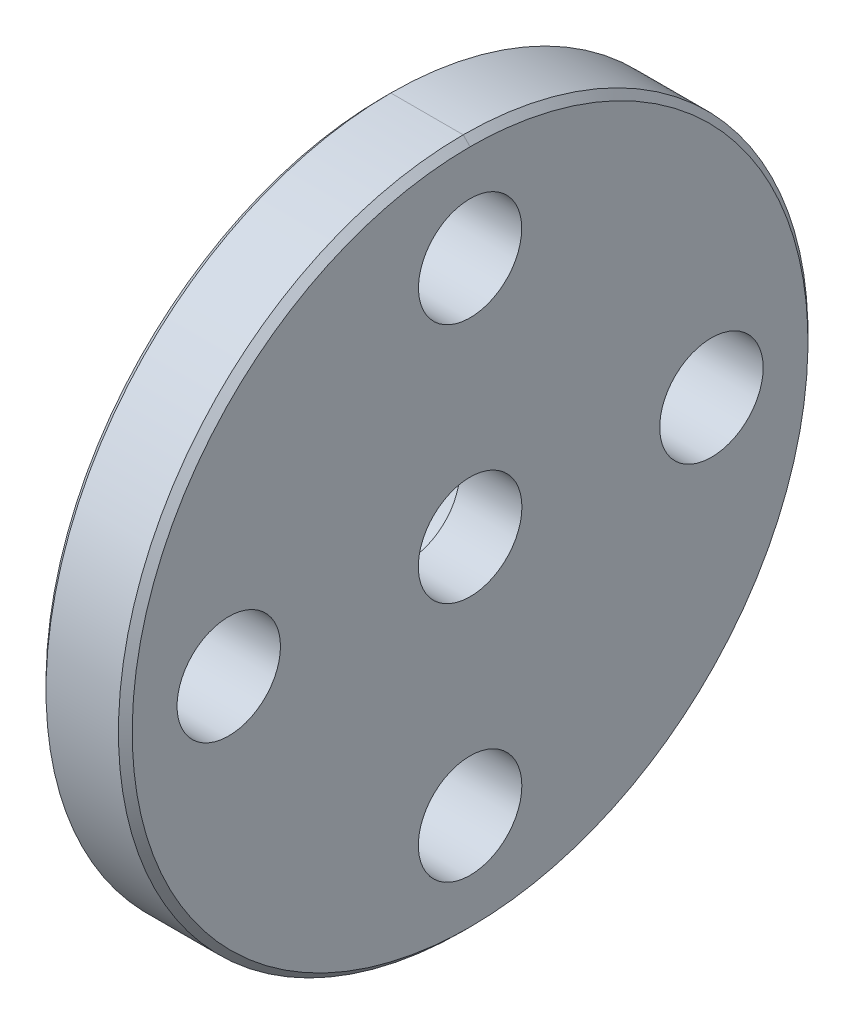
ISO-10303-21;
HEADER;
FILE_DESCRIPTION(('STEP AP214'),'2;1');
FILE_NAME('part.step','',(''),(''),'','','');
FILE_SCHEMA(('AUTOMOTIVE_DESIGN { 1 0 10303 214 1 1 1 1 }'));
ENDSEC;
DATA;
#1=APPLICATION_CONTEXT('core data for automotive mechanical design processes');
#2=APPLICATION_PROTOCOL_DEFINITION('international standard','automotive_design',2000,#1);
#3=PRODUCT_CONTEXT('',#1,'mechanical');
#4=PRODUCT('Part','Part','',(#3));
#5=PRODUCT_RELATED_PRODUCT_CATEGORY('part','',(#4));
#6=PRODUCT_DEFINITION_FORMATION('','',#4);
#7=PRODUCT_DEFINITION_CONTEXT('part definition',#1,'design');
#8=PRODUCT_DEFINITION('design','',#6,#7);
#9=PRODUCT_DEFINITION_SHAPE('','',#8);
#10=(LENGTH_UNIT() NAMED_UNIT(*) SI_UNIT(.MILLI.,.METRE.));
#11=(NAMED_UNIT(*) PLANE_ANGLE_UNIT() SI_UNIT($,.RADIAN.));
#12=(NAMED_UNIT(*) SI_UNIT($,.STERADIAN.) SOLID_ANGLE_UNIT());
#13=UNCERTAINTY_MEASURE_WITH_UNIT(LENGTH_MEASURE(1.E-05),#10,'distance_accuracy_value','');
#14=(GEOMETRIC_REPRESENTATION_CONTEXT(3) GLOBAL_UNCERTAINTY_ASSIGNED_CONTEXT((#13)) GLOBAL_UNIT_ASSIGNED_CONTEXT((#10,
#11,#12)) REPRESENTATION_CONTEXT('',''));
#15=CARTESIAN_POINT('',(0.,0.,0.));
#16=DIRECTION('',(0.,0.,1.));
#17=DIRECTION('',(1.,0.,0.));
#18=AXIS2_PLACEMENT_3D('',#15,#16,#17);
#19=CARTESIAN_POINT('',(29.998782131604,-72.9841148090467,91.5821207512656));
#20=DIRECTION('',(1.,0.,0.));
#21=DIRECTION('',(0.,1.,0.));
#22=AXIS2_PLACEMENT_3D('',#19,#20,#21);
#23=CYLINDRICAL_SURFACE('',#22,2.35);
#24=CARTESIAN_POINT('',(28.798782131604,-70.6341148090467,91.5821207512154));
#25=CARTESIAN_POINT('',(31.198782131604,-70.6341148090467,91.5821207512154));
#26=(BOUNDED_CURVE() B_SPLINE_CURVE(1,(#24,#25),.UNSPECIFIED.,.F.,
.F.) B_SPLINE_CURVE_WITH_KNOTS((2,2),(0.,2.4),
.UNSPECIFIED.) CURVE() GEOMETRIC_REPRESENTATION_ITEM() RATIONAL_B_SPLINE_CURVE((1.,1.)) REPRESENTATION_ITEM(''));
#27=CARTESIAN_POINT('',(28.798782131604,-70.6341148090467,91.5821207512154));
#28=VERTEX_POINT('',#27);
#29=CARTESIAN_POINT('',(31.198782131604,-70.6341148090467,91.5821207512154));
#30=VERTEX_POINT('',#29);
#31=EDGE_CURVE('E81',#28,#30,#26,.T.);
#32=ORIENTED_EDGE('',*,*,#31,.T.);
#33=CARTESIAN_POINT('',(31.198782131604,-70.6341148090467,91.5821207512154));
#34=CARTESIAN_POINT('',(31.198782131604,-70.6341148089966,93.9321207512156));
#35=CARTESIAN_POINT('',(31.198782131604,-72.9841148089966,93.9321207512656));
#36=CARTESIAN_POINT('',(31.198782131604,-75.3341148089965,93.9321207513156));
#37=CARTESIAN_POINT('',(31.198782131604,-75.3341148090467,91.5821207513157));
#38=(BOUNDED_CURVE() B_SPLINE_CURVE(2,(#33,#34,#35,#36,#37),.UNSPECIFIED.,.F.,
.F.) B_SPLINE_CURVE_WITH_KNOTS((3,2,3),(7.38274273593601,11.074114103904,14.765485471872),
.UNSPECIFIED.) CURVE() GEOMETRIC_REPRESENTATION_ITEM() RATIONAL_B_SPLINE_CURVE((1.,
0.707106781186548,1.,0.707106781186548,1.)) REPRESENTATION_ITEM(''));
#39=CARTESIAN_POINT('',(31.198782131604,-75.3341148090467,91.5821207513157));
#40=VERTEX_POINT('',#39);
#41=EDGE_CURVE('E214',#30,#40,#38,.T.);
#42=ORIENTED_EDGE('',*,*,#41,.T.);
#43=CARTESIAN_POINT('',(28.798782131604,-75.3341148090467,91.5821207513157));
#44=CARTESIAN_POINT('',(30.998782131604,-75.3341148090467,91.5821207513157));
#45=CARTESIAN_POINT('',(31.198782131604,-75.3341148090467,91.5821207513157));
#46=(BOUNDED_CURVE() B_SPLINE_CURVE(1,(#43,#44,#45),.UNSPECIFIED.,.F.,
.F.) B_SPLINE_CURVE_WITH_KNOTS((2,1,2),(0.299999999999963,2.5,2.69999999999995),
.UNSPECIFIED.) CURVE() GEOMETRIC_REPRESENTATION_ITEM() RATIONAL_B_SPLINE_CURVE((1.,1.,1.)) REPRESENTATION_ITEM(''));
#47=CARTESIAN_POINT('',(28.798782131604,-75.3341148090467,91.5821207513157));
#48=VERTEX_POINT('',#47);
#49=EDGE_CURVE('E71',#48,#40,#46,.T.);
#50=ORIENTED_EDGE('',*,*,#49,.F.);
#51=CARTESIAN_POINT('',(28.798782131604,-70.6341148090467,91.5821207512154));
#52=CARTESIAN_POINT('',(28.798782131604,-70.6341148089965,93.9321207512156));
#53=CARTESIAN_POINT('',(28.798782131604,-72.9841148089965,93.9321207512656));
#54=CARTESIAN_POINT('',(28.798782131604,-75.3341148089965,93.9321207513156));
#55=CARTESIAN_POINT('',(28.798782131604,-75.3341148090467,91.5821207513157));
#56=(BOUNDED_CURVE() B_SPLINE_CURVE(2,(#51,#52,#53,#54,#55),.UNSPECIFIED.,.F.,
.F.) B_SPLINE_CURVE_WITH_KNOTS((3,2,3),(7.38274273593601,11.074114103904,14.765485471872),
.UNSPECIFIED.) CURVE() GEOMETRIC_REPRESENTATION_ITEM() RATIONAL_B_SPLINE_CURVE((1.,
0.707106781186548,1.,0.707106781186548,1.)) REPRESENTATION_ITEM(''));
#57=EDGE_CURVE('E190',#28,#48,#56,.T.);
#58=ORIENTED_EDGE('',*,*,#57,.F.);
#59=EDGE_LOOP('',(#32,#42,#50,#58));
#60=FACE_BOUND('',#59,.T.);
#61=ADVANCED_FACE('F49',(#60),#23,.F.);
#62=CARTESIAN_POINT('',(28.9987821316039,-68.9841148090466,91.5821207511803));
#63=CARTESIAN_POINT('',(28.7987821316039,-69.1841148090466,91.5821207511846));
#64=CARTESIAN_POINT('',(28.9987821316039,-68.9841148091318,87.5821207511803));
#65=CARTESIAN_POINT('',(28.7987821316039,-69.1841148091275,87.7821207511846));
#66=CARTESIAN_POINT('',(28.9987821316039,-72.9841148091318,87.5821207512655));
#67=CARTESIAN_POINT('',(28.7987821316039,-72.9841148091276,87.7821207512655));
#68=CARTESIAN_POINT('',(28.9987821316039,-76.9841148091319,87.5821207513507));
#69=CARTESIAN_POINT('',(28.7987821316039,-76.7841148091276,87.7821207513465));
#70=CARTESIAN_POINT('',(28.9987821316039,-76.9841148090466,91.5821207513508));
#71=CARTESIAN_POINT('',(28.7987821316039,-76.7841148090467,91.5821207513465));
#72=(BOUNDED_SURFACE() B_SPLINE_SURFACE(2,1,((#62,#63),(#64,#65),(#66,#67),(#68,#69),(#70,#71)),
.UNSPECIFIED.,.F.,.F.,.F.) B_SPLINE_SURFACE_WITH_KNOTS((3,2,3),(2,2),(11.9377504733107,
17.906625709966,23.8755009466214),(0.,0.298660663245584),
.UNSPECIFIED.) GEOMETRIC_REPRESENTATION_ITEM() RATIONAL_B_SPLINE_SURFACE(((1.,1.),
(0.707106781186548,0.707106781186548),(1.,1.),(0.707106781186548,0.707106781186548),(1.,1.))) REPRESENTATION_ITEM('') SURFACE());
#73=CARTESIAN_POINT('',(28.9987821316039,-68.9841148090466,91.5821207511804));
#74=CARTESIAN_POINT('',(28.9987821316039,-68.9841148091319,87.5821207511803));
#75=CARTESIAN_POINT('',(28.9987821316039,-72.9841148091318,87.5821207512655));
#76=CARTESIAN_POINT('',(28.9987821316039,-76.9841148091319,87.5821207513507));
#77=CARTESIAN_POINT('',(28.9987821316039,-76.9841148090466,91.5821207513508));
#78=(BOUNDED_CURVE() B_SPLINE_CURVE(2,(#73,#74,#75,#76,#77),.UNSPECIFIED.,.F.,
.F.) B_SPLINE_CURVE_WITH_KNOTS((3,2,3),(11.9377504733106,17.906625709966,23.8755009466214),
.UNSPECIFIED.) CURVE() GEOMETRIC_REPRESENTATION_ITEM() RATIONAL_B_SPLINE_CURVE((1.,
0.707106781186545,1.,0.707106781186545,1.)) REPRESENTATION_ITEM(''));
#79=CARTESIAN_POINT('',(28.9987821316039,-68.9841148090466,91.5821207511804));
#80=VERTEX_POINT('',#79);
#81=CARTESIAN_POINT('',(28.9987821316039,-76.9841148090466,91.5821207513508));
#82=VERTEX_POINT('',#81);
#83=EDGE_CURVE('E277',#80,#82,#78,.T.);
#84=CARTESIAN_POINT('',(28.9987821316039,-76.9841148090466,91.5821207513508));
#85=CARTESIAN_POINT('',(28.7987821316039,-76.7841148090467,91.5821207513465));
#86=(BOUNDED_CURVE() B_SPLINE_CURVE(1,(#84,#85),.UNSPECIFIED.,.F.,
.F.) B_SPLINE_CURVE_WITH_KNOTS((2,2),(0.,0.298660663245584),
.UNSPECIFIED.) CURVE() GEOMETRIC_REPRESENTATION_ITEM() RATIONAL_B_SPLINE_CURVE((1.,1.)) REPRESENTATION_ITEM(''));
#87=CARTESIAN_POINT('',(28.7987821316039,-76.7841148090467,91.5821207513465));
#88=VERTEX_POINT('',#87);
#89=EDGE_CURVE('E424',#82,#88,#86,.T.);
#90=CARTESIAN_POINT('',(28.7987821316039,-69.1841148090466,91.5821207511846));
#91=CARTESIAN_POINT('',(28.7987821316039,-69.1841148091275,87.7821207511846));
#92=CARTESIAN_POINT('',(28.7987821316039,-72.9841148091276,87.7821207512655));
#93=CARTESIAN_POINT('',(28.7987821316039,-76.7841148091276,87.7821207513465));
#94=CARTESIAN_POINT('',(28.7987821316039,-76.7841148090467,91.5821207513465));
#95=(BOUNDED_CURVE() B_SPLINE_CURVE(2,(#90,#91,#92,#93,#94),.UNSPECIFIED.,.F.,
.F.) B_SPLINE_CURVE_WITH_KNOTS((3,2,3),(11.9377504733107,17.906625709966,23.8755009466214),
.UNSPECIFIED.) CURVE() GEOMETRIC_REPRESENTATION_ITEM() RATIONAL_B_SPLINE_CURVE((1.,
0.707106781186548,1.,0.707106781186548,1.)) REPRESENTATION_ITEM(''));
#96=CARTESIAN_POINT('',(28.7987821316039,-69.1841148090466,91.5821207511846));
#97=VERTEX_POINT('',#96);
#98=EDGE_CURVE('E239',#97,#88,#95,.T.);
#99=CARTESIAN_POINT('',(28.9987821316039,-68.9841148090466,91.5821207511803));
#100=CARTESIAN_POINT('',(28.7987821316039,-69.1841148090466,91.5821207511846));
#101=(BOUNDED_CURVE() B_SPLINE_CURVE(1,(#99,#100),.UNSPECIFIED.,.F.,
.F.) B_SPLINE_CURVE_WITH_KNOTS((2,2),(0.,0.298660663245584),
.UNSPECIFIED.) CURVE() GEOMETRIC_REPRESENTATION_ITEM() RATIONAL_B_SPLINE_CURVE((1.,1.)) REPRESENTATION_ITEM(''));
#102=EDGE_CURVE('E198',#80,#97,#101,.T.);
#103=ORIENTED_EDGE('',*,*,#83,.T.);
#104=ORIENTED_EDGE('',*,*,#89,.T.);
#105=ORIENTED_EDGE('',*,*,#98,.F.);
#106=ORIENTED_EDGE('',*,*,#102,.F.);
#107=EDGE_LOOP('',(#103,#104,#105,#106));
#108=FACE_BOUND('',#107,.T.);
#109=ADVANCED_FACE('F475',(#108),#72,.T.);
#110=CARTESIAN_POINT('',(29.498782131604,-72.9841148090466,91.5821207512656));
#111=DIRECTION('',(1.,0.,0.));
#112=DIRECTION('',(0.,1.,0.));
#113=AXIS2_PLACEMENT_3D('',#110,#111,#112);
#114=CYLINDRICAL_SURFACE('',#113,4.);
#115=CARTESIAN_POINT('',(30.2987821316041,-68.9841148090466,91.5821207511804));
#116=CARTESIAN_POINT('',(28.998782131604,-68.9841148090466,91.5821207511804));
#117=(BOUNDED_CURVE() B_SPLINE_CURVE(1,(#115,#116),.UNSPECIFIED.,.F.,
.F.) B_SPLINE_CURVE_WITH_KNOTS((2,2),(0.199999999999992,1.50000000000006),
.UNSPECIFIED.) CURVE() GEOMETRIC_REPRESENTATION_ITEM() RATIONAL_B_SPLINE_CURVE((1.,1.)) REPRESENTATION_ITEM(''));
#118=CARTESIAN_POINT('',(30.298782131604,-68.9841148090466,91.5821207511803));
#119=VERTEX_POINT('',#118);
#120=EDGE_CURVE('E286',#119,#80,#117,.T.);
#121=ORIENTED_EDGE('',*,*,#120,.T.);
#122=CARTESIAN_POINT('',(28.9987821316039,-76.9841148090466,91.5821207513508));
#123=CARTESIAN_POINT('',(28.9987821316039,-76.9841148089614,95.5821207513508));
#124=CARTESIAN_POINT('',(28.9987821316039,-72.9841148089614,95.5821207512656));
#125=CARTESIAN_POINT('',(28.9987821316039,-68.9841148089614,95.5821207511804));
#126=CARTESIAN_POINT('',(28.9987821316039,-68.9841148090466,91.5821207511804));
#127=(BOUNDED_CURVE() B_SPLINE_CURVE(2,(#122,#123,#124,#125,#126),.UNSPECIFIED.,.F.,
.F.) B_SPLINE_CURVE_WITH_KNOTS((3,2,3),(0.,5.96887523665532,11.9377504733106),
.UNSPECIFIED.) CURVE() GEOMETRIC_REPRESENTATION_ITEM() RATIONAL_B_SPLINE_CURVE((1.,
0.70710678118655,1.,0.70710678118655,1.)) REPRESENTATION_ITEM(''));
#128=EDGE_CURVE('E408',#82,#80,#127,.T.);
#129=ORIENTED_EDGE('',*,*,#128,.F.);
#130=CARTESIAN_POINT('',(30.298782131604,-76.9841148090466,91.5821207513508));
#131=CARTESIAN_POINT('',(28.9987821316039,-76.9841148090466,91.5821207513508));
#132=(BOUNDED_CURVE() B_SPLINE_CURVE(1,(#130,#131),.UNSPECIFIED.,.F.,
.F.) B_SPLINE_CURVE_WITH_KNOTS((2,2),(0.199999999999992,1.50000000000003),
.UNSPECIFIED.) CURVE() GEOMETRIC_REPRESENTATION_ITEM() RATIONAL_B_SPLINE_CURVE((1.,1.)) REPRESENTATION_ITEM(''));
#133=CARTESIAN_POINT('',(30.298782131604,-76.9841148090466,91.5821207513508));
#134=VERTEX_POINT('',#133);
#135=EDGE_CURVE('E287',#134,#82,#132,.T.);
#136=ORIENTED_EDGE('',*,*,#135,.F.);
#137=CARTESIAN_POINT('',(30.298782131604,-68.9841148090466,91.5821207511803));
#138=CARTESIAN_POINT('',(30.298782131604,-68.9841148089612,95.5821207511803));
#139=CARTESIAN_POINT('',(30.298782131604,-72.9841148089613,95.5821207512655));
#140=CARTESIAN_POINT('',(30.298782131604,-76.9841148089613,95.5821207513508));
#141=CARTESIAN_POINT('',(30.298782131604,-76.9841148090466,91.5821207513508));
#142=(BOUNDED_CURVE() B_SPLINE_CURVE(2,(#137,#138,#139,#140,#141),.UNSPECIFIED.,.F.,
.F.) B_SPLINE_CURVE_WITH_KNOTS((3,2,3),(13.1946839362894,19.7920259044341,26.3893678725789),
.UNSPECIFIED.) CURVE() GEOMETRIC_REPRESENTATION_ITEM() RATIONAL_B_SPLINE_CURVE((1.,
0.707106781186547,1.,0.707106781186547,1.)) REPRESENTATION_ITEM(''));
#143=EDGE_CURVE('E11',#119,#134,#142,.T.);
#144=ORIENTED_EDGE('',*,*,#143,.F.);
#145=EDGE_LOOP('',(#121,#129,#136,#144));
#146=FACE_BOUND('',#145,.T.);
#147=ADVANCED_FACE('F485',(#146),#114,.T.);
#148=CARTESIAN_POINT('',(30.298782131604,-68.9841148090465,91.5821207511803));
#149=CARTESIAN_POINT('',(30.498782131604,-68.784114809043,91.5821207511761));
#150=CARTESIAN_POINT('',(30.298782131604,-68.9841148089612,95.5821207511803));
#151=CARTESIAN_POINT('',(30.498782131604,-68.7841148089535,95.7821207511796));
#152=CARTESIAN_POINT('',(30.298782131604,-72.9841148089613,95.5821207512656));
#153=CARTESIAN_POINT('',(30.498782131604,-72.9841148089571,95.7821207512691));
#154=CARTESIAN_POINT('',(30.298782131604,-76.9841148089615,95.5821207513509));
#155=CARTESIAN_POINT('',(30.498782131604,-77.1841148089606,95.7821207513587));
#156=CARTESIAN_POINT('',(30.298782131604,-76.9841148090466,91.5821207513508));
#157=CARTESIAN_POINT('',(30.498782131604,-77.1841148090501,91.582120751355));
#158=(BOUNDED_SURFACE() B_SPLINE_SURFACE(2,1,((#148,#149),(#150,#151),(#152,#153),(#154,#155),
(#156,#157)),.UNSPECIFIED.,.F.,.F.,.F.) B_SPLINE_SURFACE_WITH_KNOTS((3,2,3),(2,2),
(13.1946839362894,19.7920259044341,26.3893678725789),(0.,0.283684158372664),
.UNSPECIFIED.) GEOMETRIC_REPRESENTATION_ITEM() RATIONAL_B_SPLINE_SURFACE(((1.,1.),
(0.707106781186548,0.707106781186548),(1.,1.),(0.707106781186548,0.707106781186548),(1.,1.))) REPRESENTATION_ITEM('') SURFACE());
#159=CARTESIAN_POINT('',(30.298782131604,-76.9841148090466,91.5821207513508));
#160=CARTESIAN_POINT('',(30.498782131604,-77.1841148090501,91.582120751355));
#161=(BOUNDED_CURVE() B_SPLINE_CURVE(1,(#159,#160),.UNSPECIFIED.,.F.,
.F.) B_SPLINE_CURVE_WITH_KNOTS((2,2),(0.,0.283684158372664),
.UNSPECIFIED.) CURVE() GEOMETRIC_REPRESENTATION_ITEM() RATIONAL_B_SPLINE_CURVE((1.,1.)) REPRESENTATION_ITEM(''));
#162=CARTESIAN_POINT('',(30.498782131604,-77.1841148090501,91.582120751355));
#163=VERTEX_POINT('',#162);
#164=EDGE_CURVE('E329',#134,#163,#161,.T.);
#165=CARTESIAN_POINT('',(30.498782131604,-68.784114809043,91.5821207511761));
#166=CARTESIAN_POINT('',(30.498782131604,-68.7841148089535,95.7821207511796));
#167=CARTESIAN_POINT('',(30.498782131604,-72.9841148089571,95.7821207512691));
#168=CARTESIAN_POINT('',(30.498782131604,-77.1841148089606,95.7821207513585));
#169=CARTESIAN_POINT('',(30.498782131604,-77.1841148090501,91.582120751355));
#170=(BOUNDED_CURVE() B_SPLINE_CURVE(2,(#165,#166,#167,#168,#169),.UNSPECIFIED.,.F.,
.F.) B_SPLINE_CURVE_WITH_KNOTS((3,2,3),(13.1946839362894,19.7920259044342,26.3893678725789),
.UNSPECIFIED.) CURVE() GEOMETRIC_REPRESENTATION_ITEM() RATIONAL_B_SPLINE_CURVE((1.,
0.707106781186548,1.,0.707106781186548,1.)) REPRESENTATION_ITEM(''));
#171=CARTESIAN_POINT('',(30.498782131604,-68.784114809043,91.5821207511761));
#172=VERTEX_POINT('',#171);
#173=EDGE_CURVE('E168',#172,#163,#170,.T.);
#174=CARTESIAN_POINT('',(30.298782131604,-68.9841148090465,91.5821207511803));
#175=CARTESIAN_POINT('',(30.498782131604,-68.784114809043,91.5821207511761));
#176=(BOUNDED_CURVE() B_SPLINE_CURVE(1,(#174,#175),.UNSPECIFIED.,.F.,
.F.) B_SPLINE_CURVE_WITH_KNOTS((2,2),(0.,0.283684158372664),
.UNSPECIFIED.) CURVE() GEOMETRIC_REPRESENTATION_ITEM() RATIONAL_B_SPLINE_CURVE((1.,1.)) REPRESENTATION_ITEM(''));
#177=EDGE_CURVE('E321',#119,#172,#176,.T.);
#178=ORIENTED_EDGE('',*,*,#143,.T.);
#179=ORIENTED_EDGE('',*,*,#164,.T.);
#180=ORIENTED_EDGE('',*,*,#173,.F.);
#181=ORIENTED_EDGE('',*,*,#177,.F.);
#182=EDGE_LOOP('',(#178,#179,#180,#181));
#183=FACE_BOUND('',#182,.T.);
#184=ADVANCED_FACE('F497',(#183),#158,.T.);
#185=CARTESIAN_POINT('',(32.7987821316026,-62.9841148090466,91.5821207510525));
#186=CARTESIAN_POINT('',(32.9987821316027,-63.1841148089811,91.5821207510568));
#187=CARTESIAN_POINT('',(32.7987821316029,-62.9841148088335,101.582120751053));
#188=CARTESIAN_POINT('',(32.9987821316029,-63.1841148087723,101.382120751122));
#189=CARTESIAN_POINT('',(32.7987821316036,-72.9841148088335,101.582120751266));
#190=CARTESIAN_POINT('',(32.9987821316036,-72.9841148088377,101.382120751331));
#191=CARTESIAN_POINT('',(32.7987821316043,-82.9841148088335,101.582120751479));
#192=CARTESIAN_POINT('',(32.9987821316043,-82.7841148089032,101.38212075154));
#193=CARTESIAN_POINT('',(32.7987821316041,-82.9841148090465,91.5821207514786));
#194=CARTESIAN_POINT('',(32.9987821316041,-82.784114809112,91.5821207514744));
#195=(BOUNDED_SURFACE() B_SPLINE_SURFACE(2,1,((#185,#186),(#187,#188),(#189,#190),(#191,#192),
(#193,#194)),.UNSPECIFIED.,.F.,.F.,.F.) B_SPLINE_SURFACE_WITH_KNOTS((3,2,3),(2,2),
(30.7876044049581,46.1814066074371,61.5752088099162),(0.,0.283092981276021),
.UNSPECIFIED.) GEOMETRIC_REPRESENTATION_ITEM() RATIONAL_B_SPLINE_SURFACE(((1.,1.),
(0.707106781186548,0.707106781186548),(1.,1.),(0.707106781186548,0.707106781186548),(1.,1.))) REPRESENTATION_ITEM('') SURFACE());
#196=CARTESIAN_POINT('',(32.798782131604,-62.9841148090465,91.5821207510525));
#197=CARTESIAN_POINT('',(32.798782131604,-62.9841148088334,101.582120751053));
#198=CARTESIAN_POINT('',(32.798782131604,-72.9841148088335,101.582120751266));
#199=CARTESIAN_POINT('',(32.798782131604,-82.9841148088335,101.582120751479));
#200=CARTESIAN_POINT('',(32.7987821316041,-82.9841148090466,91.5821207514786));
#201=(BOUNDED_CURVE() B_SPLINE_CURVE(2,(#196,#197,#198,#199,#200),.UNSPECIFIED.,.F.,
.F.) B_SPLINE_CURVE_WITH_KNOTS((3,2,3),(30.7876044049581,46.1814066074371,61.5752088099162),
.UNSPECIFIED.) CURVE() GEOMETRIC_REPRESENTATION_ITEM() RATIONAL_B_SPLINE_CURVE((1.,
0.707106781186547,1.,0.707106781186547,1.)) REPRESENTATION_ITEM(''));
#202=CARTESIAN_POINT('',(32.798782131604,-62.9841148090465,91.5821207510525));
#203=VERTEX_POINT('',#202);
#204=CARTESIAN_POINT('',(32.7987821316041,-82.9841148090465,91.5821207514787));
#205=VERTEX_POINT('',#204);
#206=EDGE_CURVE('E59',#203,#205,#201,.T.);
#207=CARTESIAN_POINT('',(32.7987821316041,-82.9841148090465,91.5821207514787));
#208=CARTESIAN_POINT('',(32.9987821316041,-82.784114809112,91.5821207514744));
#209=(BOUNDED_CURVE() B_SPLINE_CURVE(1,(#207,#208),.UNSPECIFIED.,.F.,
.F.) B_SPLINE_CURVE_WITH_KNOTS((2,2),(0.,0.283092981276021),
.UNSPECIFIED.) CURVE() GEOMETRIC_REPRESENTATION_ITEM() RATIONAL_B_SPLINE_CURVE((1.,1.)) REPRESENTATION_ITEM(''));
#210=CARTESIAN_POINT('',(32.9987821316041,-82.784114809112,91.5821207514744));
#211=VERTEX_POINT('',#210);
#212=EDGE_CURVE('E313',#205,#211,#209,.T.);
#213=CARTESIAN_POINT('',(32.998782131604,-63.1841148089812,91.5821207510568));
#214=CARTESIAN_POINT('',(32.998782131604,-63.1841148087724,101.382120751122));
#215=CARTESIAN_POINT('',(32.998782131604,-72.9841148088377,101.382120751331));
#216=CARTESIAN_POINT('',(32.998782131604,-82.784114808903,101.38212075154));
#217=CARTESIAN_POINT('',(32.998782131604,-82.7841148091119,91.5821207514744));
#218=(BOUNDED_CURVE() B_SPLINE_CURVE(2,(#213,#214,#215,#216,#217),.UNSPECIFIED.,.F.,
.F.) B_SPLINE_CURVE_WITH_KNOTS((3,2,3),(30.7876044049581,46.1814066074371,61.5752088099162),
.UNSPECIFIED.) CURVE() GEOMETRIC_REPRESENTATION_ITEM() RATIONAL_B_SPLINE_CURVE((1.,
0.707106781186547,1.,0.707106781186547,1.)) REPRESENTATION_ITEM(''));
#219=CARTESIAN_POINT('',(32.998782131604,-63.1841148089812,91.5821207510568));
#220=VERTEX_POINT('',#219);
#221=EDGE_CURVE('E276',#220,#211,#218,.T.);
#222=CARTESIAN_POINT('',(32.7987821316026,-62.9841148090466,91.5821207510525));
#223=CARTESIAN_POINT('',(32.9987821316027,-63.1841148089811,91.5821207510568));
#224=(BOUNDED_CURVE() B_SPLINE_CURVE(1,(#222,#223),.UNSPECIFIED.,.F.,
.F.) B_SPLINE_CURVE_WITH_KNOTS((2,2),(0.,0.283092981276021),
.UNSPECIFIED.) CURVE() GEOMETRIC_REPRESENTATION_ITEM() RATIONAL_B_SPLINE_CURVE((1.,1.)) REPRESENTATION_ITEM(''));
#225=EDGE_CURVE('E296',#203,#220,#224,.T.);
#226=ORIENTED_EDGE('',*,*,#206,.T.);
#227=ORIENTED_EDGE('',*,*,#212,.T.);
#228=ORIENTED_EDGE('',*,*,#221,.F.);
#229=ORIENTED_EDGE('',*,*,#225,.F.);
#230=EDGE_LOOP('',(#226,#227,#228,#229));
#231=FACE_BOUND('',#230,.T.);
#232=ADVANCED_FACE('F537',(#231),#195,.T.);
#233=CARTESIAN_POINT('',(30.698782131604,-62.9841148090466,91.5821207510525));
#234=CARTESIAN_POINT('',(30.698782131604,-62.9841148088335,101.582120751053));
#235=CARTESIAN_POINT('',(30.698782131604,-72.9841148088335,101.582120751266));
#236=CARTESIAN_POINT('',(30.698782131604,-82.9841148088335,101.582120751479));
#237=CARTESIAN_POINT('',(30.698782131604,-82.9841148090466,91.5821207514786));
#238=CARTESIAN_POINT('',(30.4987821316041,-63.1841148089811,91.5821207510567));
#239=CARTESIAN_POINT('',(30.4987821316041,-63.1841148087723,101.382120751122));
#240=CARTESIAN_POINT('',(30.4987821316041,-72.9841148088377,101.382120751331));
#241=CARTESIAN_POINT('',(30.4987821316041,-82.7841148089031,101.38212075154));
#242=CARTESIAN_POINT('',(30.4987821316041,-82.784114809112,91.5821207514744));
#243=(BOUNDED_SURFACE() B_SPLINE_SURFACE(1,2,((#233,#234,#235,#236,#237),(#238,#239,#240,#241,
#242)),.UNSPECIFIED.,.F.,.F.,.F.) B_SPLINE_SURFACE_WITH_KNOTS((2,2),(3,2,3),(0.,
0.283092981276209),(30.787604404958,46.181406607437,61.575208809916),
.UNSPECIFIED.) GEOMETRIC_REPRESENTATION_ITEM() RATIONAL_B_SPLINE_SURFACE(((1.,0.707106781186548,
1.,0.707106781186548,1.),(1.,0.707106781186548,1.,0.707106781186548,1.))) REPRESENTATION_ITEM('') SURFACE());
#244=CARTESIAN_POINT('',(30.698782131604,-62.9841148090466,91.5821207510525));
#245=CARTESIAN_POINT('',(30.4987821316041,-63.1841148089811,91.5821207510567));
#246=(BOUNDED_CURVE() B_SPLINE_CURVE(1,(#244,#245),.UNSPECIFIED.,.F.,
.F.) B_SPLINE_CURVE_WITH_KNOTS((2,2),(0.,0.283092981276209),
.UNSPECIFIED.) CURVE() GEOMETRIC_REPRESENTATION_ITEM() RATIONAL_B_SPLINE_CURVE((1.,1.)) REPRESENTATION_ITEM(''));
#247=CARTESIAN_POINT('',(30.698782131604,-62.9841148090466,91.5821207510525));
#248=VERTEX_POINT('',#247);
#249=CARTESIAN_POINT('',(30.498782131604,-63.1841148089812,91.5821207510567));
#250=VERTEX_POINT('',#249);
#251=EDGE_CURVE('E167',#248,#250,#246,.T.);
#252=CARTESIAN_POINT('',(30.498782131604,-63.1841148089812,91.5821207510567));
#253=CARTESIAN_POINT('',(30.498782131604,-63.1841148087724,101.382120751122));
#254=CARTESIAN_POINT('',(30.498782131604,-72.9841148088377,101.382120751331));
#255=CARTESIAN_POINT('',(30.498782131604,-82.784114808903,101.38212075154));
#256=CARTESIAN_POINT('',(30.498782131604,-82.7841148091119,91.5821207514743));
#257=(BOUNDED_CURVE() B_SPLINE_CURVE(2,(#252,#253,#254,#255,#256),.UNSPECIFIED.,.F.,
.F.) B_SPLINE_CURVE_WITH_KNOTS((3,2,3),(30.7876044049579,46.181406607437,61.575208809916),
.UNSPECIFIED.) CURVE() GEOMETRIC_REPRESENTATION_ITEM() RATIONAL_B_SPLINE_CURVE((1.,
0.707106781186547,1.,0.707106781186547,1.)) REPRESENTATION_ITEM(''));
#258=CARTESIAN_POINT('',(30.4987821316041,-82.784114809112,91.5821207514744));
#259=VERTEX_POINT('',#258);
#260=EDGE_CURVE('E172',#250,#259,#257,.T.);
#261=CARTESIAN_POINT('',(30.698782131604,-82.9841148090466,91.5821207514786));
#262=CARTESIAN_POINT('',(30.4987821316041,-82.784114809112,91.5821207514744));
#263=(BOUNDED_CURVE() B_SPLINE_CURVE(1,(#261,#262),.UNSPECIFIED.,.F.,
.F.) B_SPLINE_CURVE_WITH_KNOTS((2,2),(0.,0.283092981276209),
.UNSPECIFIED.) CURVE() GEOMETRIC_REPRESENTATION_ITEM() RATIONAL_B_SPLINE_CURVE((1.,1.)) REPRESENTATION_ITEM(''));
#264=CARTESIAN_POINT('',(30.698782131604,-82.9841148090466,91.5821207514786));
#265=VERTEX_POINT('',#264);
#266=EDGE_CURVE('E155',#265,#259,#263,.T.);
#267=CARTESIAN_POINT('',(30.698782131604,-62.9841148090466,91.5821207510525));
#268=CARTESIAN_POINT('',(30.6987821316039,-62.9841148088335,101.582120751052));
#269=CARTESIAN_POINT('',(30.698782131604,-72.9841148088335,101.582120751266));
#270=CARTESIAN_POINT('',(30.698782131604,-82.9841148088335,101.582120751479));
#271=CARTESIAN_POINT('',(30.698782131604,-82.9841148090466,91.5821207514786));
#272=(BOUNDED_CURVE() B_SPLINE_CURVE(2,(#267,#268,#269,#270,#271),.UNSPECIFIED.,.F.,
.F.) B_SPLINE_CURVE_WITH_KNOTS((3,2,3),(30.787604404958,46.181406607437,61.575208809916),
.UNSPECIFIED.) CURVE() GEOMETRIC_REPRESENTATION_ITEM() RATIONAL_B_SPLINE_CURVE((1.,
0.707106781186547,1.,0.707106781186547,1.)) REPRESENTATION_ITEM(''));
#273=EDGE_CURVE('E215',#248,#265,#272,.T.);
#274=ORIENTED_EDGE('',*,*,#251,.T.);
#275=ORIENTED_EDGE('',*,*,#260,.T.);
#276=ORIENTED_EDGE('',*,*,#266,.F.);
#277=ORIENTED_EDGE('',*,*,#273,.F.);
#278=EDGE_LOOP('',(#274,#275,#276,#277));
#279=FACE_BOUND('',#278,.T.);
#280=ADVANCED_FACE('F176',(#279),#243,.T.);
#281=CARTESIAN_POINT('',(31.748782131604,-72.9841148090465,91.5821207512656));
#282=DIRECTION('',(1.,0.,0.));
#283=DIRECTION('',(0.,1.,0.));
#284=AXIS2_PLACEMENT_3D('',#281,#282,#283);
#285=CYLINDRICAL_SURFACE('',#284,10.);
#286=CARTESIAN_POINT('',(32.798782131604,-62.9841148090465,91.5821207510525));
#287=CARTESIAN_POINT('',(30.698782131604,-62.9841148090466,91.5821207510525));
#288=(BOUNDED_CURVE() B_SPLINE_CURVE(1,(#286,#287),.UNSPECIFIED.,.F.,
.F.) B_SPLINE_CURVE_WITH_KNOTS((2,2),(0.199999999999988,2.3),
.UNSPECIFIED.) CURVE() GEOMETRIC_REPRESENTATION_ITEM() RATIONAL_B_SPLINE_CURVE((1.,1.)) REPRESENTATION_ITEM(''));
#289=EDGE_CURVE('E178',#203,#248,#288,.T.);
#290=ORIENTED_EDGE('',*,*,#289,.T.);
#291=ORIENTED_EDGE('',*,*,#273,.T.);
#292=CARTESIAN_POINT('',(32.7987821316041,-82.9841148090465,91.5821207514787));
#293=CARTESIAN_POINT('',(30.698782131604,-82.9841148090466,91.5821207514786));
#294=(BOUNDED_CURVE() B_SPLINE_CURVE(1,(#292,#293),.UNSPECIFIED.,.F.,
.F.) B_SPLINE_CURVE_WITH_KNOTS((2,2),(0.199999999999988,2.3),
.UNSPECIFIED.) CURVE() GEOMETRIC_REPRESENTATION_ITEM() RATIONAL_B_SPLINE_CURVE((1.,1.)) REPRESENTATION_ITEM(''));
#295=EDGE_CURVE('E448',#205,#265,#294,.T.);
#296=ORIENTED_EDGE('',*,*,#295,.F.);
#297=ORIENTED_EDGE('',*,*,#206,.F.);
#298=EDGE_LOOP('',(#290,#291,#296,#297));
#299=FACE_BOUND('',#298,.T.);
#300=ADVANCED_FACE('F557',(#299),#285,.T.);
#301=CARTESIAN_POINT('',(29.998782131604,-72.9841148090467,91.5821207512655));
#302=DIRECTION('',(1.,0.,0.));
#303=DIRECTION('',(0.,1.,0.));
#304=AXIS2_PLACEMENT_3D('',#301,#302,#303);
#305=CYLINDRICAL_SURFACE('',#304,2.35);
#306=CARTESIAN_POINT('',(28.798782131604,-75.3341148090467,91.5821207513157));
#307=CARTESIAN_POINT('',(28.798782131604,-75.3341148090967,89.2321207513157));
#308=CARTESIAN_POINT('',(28.798782131604,-72.9841148090967,89.2321207512655));
#309=CARTESIAN_POINT('',(28.798782131604,-70.6341148090966,89.2321207512155));
#310=CARTESIAN_POINT('',(28.798782131604,-70.6341148090467,91.5821207512154));
#311=(BOUNDED_CURVE() B_SPLINE_CURVE(2,(#306,#307,#308,#309,#310),.UNSPECIFIED.,.F.,
.F.) B_SPLINE_CURVE_WITH_KNOTS((3,2,3),(0.,3.69137136796801,7.38274273593601),
.UNSPECIFIED.) CURVE() GEOMETRIC_REPRESENTATION_ITEM() RATIONAL_B_SPLINE_CURVE((1.,
0.707106781186548,1.,0.707106781186548,1.)) REPRESENTATION_ITEM(''));
#312=EDGE_CURVE('E199',#48,#28,#311,.T.);
#313=ORIENTED_EDGE('',*,*,#312,.F.);
#314=ORIENTED_EDGE('',*,*,#49,.T.);
#315=CARTESIAN_POINT('',(31.198782131604,-75.3341148090467,91.5821207513157));
#316=CARTESIAN_POINT('',(31.198782131604,-75.3341148090967,89.2321207513157));
#317=CARTESIAN_POINT('',(31.198782131604,-72.9841148090967,89.2321207512655));
#318=CARTESIAN_POINT('',(31.198782131604,-70.6341148090968,89.2321207512155));
#319=CARTESIAN_POINT('',(31.198782131604,-70.6341148090467,91.5821207512154));
#320=(BOUNDED_CURVE() B_SPLINE_CURVE(2,(#315,#316,#317,#318,#319),.UNSPECIFIED.,.F.,
.F.) B_SPLINE_CURVE_WITH_KNOTS((3,2,3),(0.,3.69137136796801,7.38274273593601),
.UNSPECIFIED.) CURVE() GEOMETRIC_REPRESENTATION_ITEM() RATIONAL_B_SPLINE_CURVE((1.,
0.707106781186548,1.,0.707106781186548,1.)) REPRESENTATION_ITEM(''));
#321=EDGE_CURVE('E206',#40,#30,#320,.T.);
#322=ORIENTED_EDGE('',*,*,#321,.T.);
#323=ORIENTED_EDGE('',*,*,#31,.F.);
#324=EDGE_LOOP('',(#313,#314,#322,#323));
#325=FACE_BOUND('',#324,.T.);
#326=ADVANCED_FACE('F51',(#325),#305,.F.);
#327=CARTESIAN_POINT('',(31.1987821316039,-75.9216148091092,88.644620751328));
#328=DIRECTION('',(-1.,0.,0.));
#329=DIRECTION('',(0.,0.,1.));
#330=AXIS2_PLACEMENT_3D('',#327,#328,#329);
#331=PLANE('',#330);
#332=CARTESIAN_POINT('',(31.1987821316039,-72.9841148090466,91.5821207512655));
#333=DIRECTION('',(-1.,0.,0.));
#334=DIRECTION('',(0.,0.,1.));
#335=AXIS2_PLACEMENT_3D('',#332,#333,#334);
#336=CIRCLE('',#335,1.50304545185923);
#337=CARTESIAN_POINT('',(31.1987821316039,-72.9841148090466,93.0851662031248));
#338=VERTEX_POINT('',#337);
#339=EDGE_CURVE('E639',#338,#338,#336,.T.);
#340=ORIENTED_EDGE('',*,*,#339,.F.);
#341=EDGE_LOOP('',(#340));
#342=FACE_BOUND('',#341,.T.);
#343=ORIENTED_EDGE('',*,*,#41,.F.);
#344=ORIENTED_EDGE('',*,*,#321,.F.);
#345=EDGE_LOOP('',(#343,#344));
#346=FACE_BOUND('',#345,.T.);
#347=ADVANCED_FACE('F558',(#342,#346),#331,.T.);
#348=CARTESIAN_POINT('',(28.9987821316039,-76.9841148090466,91.5821207513508));
#349=CARTESIAN_POINT('',(28.7987821316039,-76.7841148090467,91.5821207513465));
#350=CARTESIAN_POINT('',(28.9987821316039,-76.9841148089615,95.5821207513508));
#351=CARTESIAN_POINT('',(28.7987821316039,-76.7841148089657,95.3821207513467));
#352=CARTESIAN_POINT('',(28.9987821316039,-72.9841148089614,95.5821207512656));
#353=CARTESIAN_POINT('',(28.7987821316039,-72.9841148089656,95.3821207512656));
#354=CARTESIAN_POINT('',(28.9987821316039,-68.9841148089614,95.5821207511803));
#355=CARTESIAN_POINT('',(28.7987821316039,-69.1841148089657,95.3821207511846));
#356=CARTESIAN_POINT('',(28.9987821316039,-68.9841148090466,91.5821207511803));
#357=CARTESIAN_POINT('',(28.7987821316039,-69.1841148090466,91.5821207511846));
#358=(BOUNDED_SURFACE() B_SPLINE_SURFACE(2,1,((#348,#349),(#350,#351),(#352,#353),(#354,#355),
(#356,#357)),.UNSPECIFIED.,.F.,.F.,.F.) B_SPLINE_SURFACE_WITH_KNOTS((3,2,3),(2,2),(0.,
5.96887523665535,11.9377504733107),(0.,0.298660663245584),
.UNSPECIFIED.) GEOMETRIC_REPRESENTATION_ITEM() RATIONAL_B_SPLINE_SURFACE(((1.,1.),
(0.707106781186548,0.707106781186548),(1.,1.),(0.707106781186548,0.707106781186548),(1.,1.))) REPRESENTATION_ITEM('') SURFACE());
#359=CARTESIAN_POINT('',(28.7987821316039,-76.7841148090467,91.5821207513465));
#360=CARTESIAN_POINT('',(28.7987821316039,-76.7841148089657,95.3821207513467));
#361=CARTESIAN_POINT('',(28.7987821316039,-72.9841148089656,95.3821207512656));
#362=CARTESIAN_POINT('',(28.7987821316039,-69.1841148089657,95.3821207511848));
#363=CARTESIAN_POINT('',(28.7987821316039,-69.1841148090466,91.5821207511846));
#364=(BOUNDED_CURVE() B_SPLINE_CURVE(2,(#359,#360,#361,#362,#363),.UNSPECIFIED.,.F.,
.F.) B_SPLINE_CURVE_WITH_KNOTS((3,2,3),(0.,5.96887523665535,11.9377504733107),
.UNSPECIFIED.) CURVE() GEOMETRIC_REPRESENTATION_ITEM() RATIONAL_B_SPLINE_CURVE((1.,
0.707106781186548,1.,0.707106781186548,1.)) REPRESENTATION_ITEM(''));
#365=EDGE_CURVE('E305',#88,#97,#364,.T.);
#366=ORIENTED_EDGE('',*,*,#102,.T.);
#367=ORIENTED_EDGE('',*,*,#365,.F.);
#368=ORIENTED_EDGE('',*,*,#89,.F.);
#369=ORIENTED_EDGE('',*,*,#128,.T.);
#370=EDGE_LOOP('',(#366,#367,#368,#369));
#371=FACE_BOUND('',#370,.T.);
#372=ADVANCED_FACE('F482',(#371),#358,.T.);
#373=CARTESIAN_POINT('',(28.7987821316039,-77.0641148091336,87.5021207513525));
#374=DIRECTION('',(-1.,0.,0.));
#375=DIRECTION('',(0.,0.,1.));
#376=AXIS2_PLACEMENT_3D('',#373,#374,#375);
#377=PLANE('',#376);
#378=ORIENTED_EDGE('',*,*,#312,.T.);
#379=ORIENTED_EDGE('',*,*,#57,.T.);
#380=EDGE_LOOP('',(#378,#379));
#381=FACE_BOUND('',#380,.T.);
#382=ORIENTED_EDGE('',*,*,#365,.T.);
#383=ORIENTED_EDGE('',*,*,#98,.T.);
#384=EDGE_LOOP('',(#382,#383));
#385=FACE_BOUND('',#384,.T.);
#386=ADVANCED_FACE('F481',(#381,#385),#377,.T.);
#387=CARTESIAN_POINT('',(29.498782131604,-72.9841148090466,91.5821207512656));
#388=DIRECTION('',(1.,0.,0.));
#389=DIRECTION('',(0.,1.,0.));
#390=AXIS2_PLACEMENT_3D('',#387,#388,#389);
#391=CYLINDRICAL_SURFACE('',#390,4.);
#392=CARTESIAN_POINT('',(30.298782131604,-76.9841148090466,91.5821207513508));
#393=CARTESIAN_POINT('',(30.298782131604,-76.9841148091319,87.5821207513507));
#394=CARTESIAN_POINT('',(30.298782131604,-72.9841148091318,87.5821207512655));
#395=CARTESIAN_POINT('',(30.298782131604,-68.9841148091318,87.5821207511803));
#396=CARTESIAN_POINT('',(30.298782131604,-68.9841148090466,91.5821207511803));
#397=(BOUNDED_CURVE() B_SPLINE_CURVE(2,(#392,#393,#394,#395,#396),.UNSPECIFIED.,.F.,
.F.) B_SPLINE_CURVE_WITH_KNOTS((3,2,3),(0.,6.59734196814471,13.1946839362894),
.UNSPECIFIED.) CURVE() GEOMETRIC_REPRESENTATION_ITEM() RATIONAL_B_SPLINE_CURVE((1.,
0.707106781186548,1.,0.707106781186548,1.)) REPRESENTATION_ITEM(''));
#398=EDGE_CURVE('E337',#134,#119,#397,.T.);
#399=ORIENTED_EDGE('',*,*,#398,.F.);
#400=ORIENTED_EDGE('',*,*,#135,.T.);
#401=ORIENTED_EDGE('',*,*,#83,.F.);
#402=ORIENTED_EDGE('',*,*,#120,.F.);
#403=EDGE_LOOP('',(#399,#400,#401,#402));
#404=FACE_BOUND('',#403,.T.);
#405=ADVANCED_FACE('F489',(#404),#391,.T.);
#406=CARTESIAN_POINT('',(30.298782131604,-76.9841148090466,91.5821207513508));
#407=CARTESIAN_POINT('',(30.498782131604,-77.1841148090501,91.582120751355));
#408=CARTESIAN_POINT('',(30.298782131604,-76.9841148091319,87.5821207513507));
#409=CARTESIAN_POINT('',(30.498782131604,-77.1841148091396,87.3821207513515));
#410=CARTESIAN_POINT('',(30.298782131604,-72.9841148091318,87.5821207512655));
#411=CARTESIAN_POINT('',(30.498782131604,-72.984114809136,87.382120751262));
#412=CARTESIAN_POINT('',(30.298782131604,-68.9841148091317,87.5821207511802));
#413=CARTESIAN_POINT('',(30.498782131604,-68.7841148091326,87.3821207511724));
#414=CARTESIAN_POINT('',(30.298782131604,-68.9841148090465,91.5821207511803));
#415=CARTESIAN_POINT('',(30.498782131604,-68.784114809043,91.5821207511761));
#416=(BOUNDED_SURFACE() B_SPLINE_SURFACE(2,1,((#406,#407),(#408,#409),(#410,#411),(#412,#413),
(#414,#415)),.UNSPECIFIED.,.F.,.F.,.F.) B_SPLINE_SURFACE_WITH_KNOTS((3,2,3),(2,2),(0.,
6.59734196814472,13.1946839362894),(0.,0.283684158372664),
.UNSPECIFIED.) GEOMETRIC_REPRESENTATION_ITEM() RATIONAL_B_SPLINE_SURFACE(((1.,1.),
(0.707106781186548,0.707106781186548),(1.,1.),(0.707106781186548,0.707106781186548),(1.,1.))) REPRESENTATION_ITEM('') SURFACE());
#417=CARTESIAN_POINT('',(30.498782131604,-77.1841148090501,91.582120751355));
#418=CARTESIAN_POINT('',(30.498782131604,-77.1841148091396,87.3821207513515));
#419=CARTESIAN_POINT('',(30.498782131604,-72.984114809136,87.382120751262));
#420=CARTESIAN_POINT('',(30.498782131604,-68.7841148091325,87.3821207511726));
#421=CARTESIAN_POINT('',(30.498782131604,-68.784114809043,91.5821207511761));
#422=(BOUNDED_CURVE() B_SPLINE_CURVE(2,(#417,#418,#419,#420,#421),.UNSPECIFIED.,.F.,
.F.) B_SPLINE_CURVE_WITH_KNOTS((3,2,3),(0.,6.59734196814472,13.1946839362894),
.UNSPECIFIED.) CURVE() GEOMETRIC_REPRESENTATION_ITEM() RATIONAL_B_SPLINE_CURVE((1.,
0.707106781186547,1.,0.707106781186547,1.)) REPRESENTATION_ITEM(''));
#423=EDGE_CURVE('E174',#163,#172,#422,.T.);
#424=ORIENTED_EDGE('',*,*,#177,.T.);
#425=ORIENTED_EDGE('',*,*,#423,.F.);
#426=ORIENTED_EDGE('',*,*,#164,.F.);
#427=ORIENTED_EDGE('',*,*,#398,.T.);
#428=EDGE_LOOP('',(#424,#425,#426,#427));
#429=FACE_BOUND('',#428,.T.);
#430=ADVANCED_FACE('F494',(#429),#416,.T.);
#431=CARTESIAN_POINT('',(32.7987821316041,-82.9841148090465,91.5821207514787));
#432=CARTESIAN_POINT('',(32.9987821316041,-82.784114809112,91.5821207514744));
#433=CARTESIAN_POINT('',(32.7987821316038,-82.9841148092596,81.5821207514787));
#434=CARTESIAN_POINT('',(32.9987821316038,-82.7841148093208,81.7821207514089));
#435=CARTESIAN_POINT('',(32.7987821316031,-72.9841148092596,81.5821207512656));
#436=CARTESIAN_POINT('',(32.9987821316031,-72.9841148092553,81.7821207512002));
#437=CARTESIAN_POINT('',(32.7987821316024,-62.9841148092596,81.5821207510526));
#438=CARTESIAN_POINT('',(32.9987821316024,-63.1841148091899,81.7821207509914));
#439=CARTESIAN_POINT('',(32.7987821316026,-62.9841148090466,91.5821207510525));
#440=CARTESIAN_POINT('',(32.9987821316027,-63.1841148089811,91.5821207510568));
#441=(BOUNDED_SURFACE() B_SPLINE_SURFACE(2,1,((#431,#432),(#433,#434),(#435,#436),(#437,#438),
(#439,#440)),.UNSPECIFIED.,.F.,.F.,.F.) B_SPLINE_SURFACE_WITH_KNOTS((3,2,3),(2,2),(0.,
15.393802202479,30.7876044049581),(0.,0.283092981276021),
.UNSPECIFIED.) GEOMETRIC_REPRESENTATION_ITEM() RATIONAL_B_SPLINE_SURFACE(((1.,1.),
(0.707106781186548,0.707106781186548),(1.,1.),(0.707106781186548,0.707106781186548),(1.,1.))) REPRESENTATION_ITEM('') SURFACE());
#442=CARTESIAN_POINT('',(32.998782131604,-82.7841148091119,91.5821207514744));
#443=CARTESIAN_POINT('',(32.998782131604,-82.7841148093207,81.782120751409));
#444=CARTESIAN_POINT('',(32.998782131604,-72.9841148092553,81.7821207512002));
#445=CARTESIAN_POINT('',(32.998782131604,-63.18411480919,81.7821207509914));
#446=CARTESIAN_POINT('',(32.998782131604,-63.1841148089812,91.5821207510568));
#447=(BOUNDED_CURVE() B_SPLINE_CURVE(2,(#442,#443,#444,#445,#446),.UNSPECIFIED.,.F.,
.F.) B_SPLINE_CURVE_WITH_KNOTS((3,2,3),(0.,15.393802202479,30.7876044049581),
.UNSPECIFIED.) CURVE() GEOMETRIC_REPRESENTATION_ITEM() RATIONAL_B_SPLINE_CURVE((1.,
0.707106781186548,1.,0.707106781186548,1.)) REPRESENTATION_ITEM(''));
#448=EDGE_CURVE('E267',#211,#220,#447,.T.);
#449=CARTESIAN_POINT('',(32.7987821316041,-82.9841148090466,91.5821207514786));
#450=CARTESIAN_POINT('',(32.7987821316041,-82.9841148092596,81.5821207514787));
#451=CARTESIAN_POINT('',(32.798782131604,-72.9841148092596,81.5821207512656));
#452=CARTESIAN_POINT('',(32.798782131604,-62.9841148092596,81.5821207510525));
#453=CARTESIAN_POINT('',(32.798782131604,-62.9841148090465,91.5821207510525));
#454=(BOUNDED_CURVE() B_SPLINE_CURVE(2,(#449,#450,#451,#452,#453),.UNSPECIFIED.,.F.,
.F.) B_SPLINE_CURVE_WITH_KNOTS((3,2,3),(0.,15.393802202479,30.7876044049581),
.UNSPECIFIED.) CURVE() GEOMETRIC_REPRESENTATION_ITEM() RATIONAL_B_SPLINE_CURVE((1.,
0.707106781186548,1.,0.707106781186548,1.)) REPRESENTATION_ITEM(''));
#455=EDGE_CURVE('E380',#205,#203,#454,.T.);
#456=ORIENTED_EDGE('',*,*,#225,.T.);
#457=ORIENTED_EDGE('',*,*,#448,.F.);
#458=ORIENTED_EDGE('',*,*,#212,.F.);
#459=ORIENTED_EDGE('',*,*,#455,.T.);
#460=EDGE_LOOP('',(#456,#457,#458,#459));
#461=FACE_BOUND('',#460,.T.);
#462=ADVANCED_FACE('F581',(#461),#441,.T.);
#463=CARTESIAN_POINT('',(32.998782131604,-60.4841148087802,104.082120750999));
#464=DIRECTION('',(1.,0.,0.));
#465=DIRECTION('',(0.,1.,0.));
#466=AXIS2_PLACEMENT_3D('',#463,#464,#465);
#467=PLANE('',#466);
#468=CARTESIAN_POINT('',(32.998782131604,-72.9841148090466,91.5821207512655));
#469=DIRECTION('',(1.,0.,0.));
#470=DIRECTION('',(0.,0.,-1.));
#471=AXIS2_PLACEMENT_3D('',#468,#469,#470);
#472=CIRCLE('',#471,1.50304545185923);
#473=CARTESIAN_POINT('',(32.998782131604,-72.9841148090466,90.0790752994063));
#474=VERTEX_POINT('',#473);
#475=EDGE_CURVE('E618',#474,#474,#472,.T.);
#476=ORIENTED_EDGE('',*,*,#475,.F.);
#477=EDGE_LOOP('',(#476));
#478=FACE_BOUND('',#477,.T.);
#479=CARTESIAN_POINT('',(32.998782131604,-72.9841148090465,84.5821207512655));
#480=DIRECTION('',(1.,0.,0.));
#481=DIRECTION('',(0.,0.,-1.));
#482=AXIS2_PLACEMENT_3D('',#479,#480,#481);
#483=CIRCLE('',#482,1.50028267950731);
#484=CARTESIAN_POINT('',(32.998782131604,-72.9841148090465,83.0818380717582));
#485=VERTEX_POINT('',#484);
#486=EDGE_CURVE('E386',#485,#485,#483,.T.);
#487=ORIENTED_EDGE('',*,*,#486,.F.);
#488=EDGE_LOOP('',(#487));
#489=FACE_BOUND('',#488,.T.);
#490=CARTESIAN_POINT('',(32.998782131604,-65.9841148090466,91.5821207512655));
#491=DIRECTION('',(1.,0.,0.));
#492=DIRECTION('',(0.,0.,-1.));
#493=AXIS2_PLACEMENT_3D('',#490,#491,#492);
#494=CIRCLE('',#493,1.49673448644924);
#495=CARTESIAN_POINT('',(32.998782131604,-65.9841148090466,90.0853862648163));
#496=VERTEX_POINT('',#495);
#497=EDGE_CURVE('E625',#496,#496,#494,.T.);
#498=ORIENTED_EDGE('',*,*,#497,.F.);
#499=EDGE_LOOP('',(#498));
#500=FACE_BOUND('',#499,.T.);
#501=CARTESIAN_POINT('',(32.998782131604,-79.9841148090466,91.5821207512656));
#502=DIRECTION('',(1.,0.,0.));
#503=DIRECTION('',(0.,0.,-1.));
#504=AXIS2_PLACEMENT_3D('',#501,#502,#503);
#505=CIRCLE('',#504,1.50107710087176);
#506=CARTESIAN_POINT('',(32.998782131604,-79.9841148090466,90.0810436503939));
#507=VERTEX_POINT('',#506);
#508=EDGE_CURVE('E402',#507,#507,#505,.T.);
#509=ORIENTED_EDGE('',*,*,#508,.F.);
#510=EDGE_LOOP('',(#509));
#511=FACE_BOUND('',#510,.T.);
#512=CARTESIAN_POINT('',(32.998782131604,-72.9841148090466,98.5821207512655));
#513=DIRECTION('',(1.,0.,0.));
#514=DIRECTION('',(0.,0.,-1.));
#515=AXIS2_PLACEMENT_3D('',#512,#513,#514);
#516=CIRCLE('',#515,1.49961470863215);
#517=CARTESIAN_POINT('',(32.998782131604,-72.9841148090466,97.0825060426334));
#518=VERTEX_POINT('',#517);
#519=EDGE_CURVE('E381',#518,#518,#516,.T.);
#520=ORIENTED_EDGE('',*,*,#519,.F.);
#521=EDGE_LOOP('',(#520));
#522=FACE_BOUND('',#521,.T.);
#523=ORIENTED_EDGE('',*,*,#448,.T.);
#524=ORIENTED_EDGE('',*,*,#221,.T.);
#525=EDGE_LOOP('',(#523,#524));
#526=FACE_BOUND('',#525,.T.);
#527=ADVANCED_FACE('F512',(#478,#489,#500,#511,#522,#526),#467,.T.);
#528=CARTESIAN_POINT('',(30.698782131604,-82.9841148090466,91.5821207514786));
#529=CARTESIAN_POINT('',(30.698782131604,-82.9841148092596,81.5821207514786));
#530=CARTESIAN_POINT('',(30.698782131604,-72.9841148092596,81.5821207512655));
#531=CARTESIAN_POINT('',(30.698782131604,-62.9841148092596,81.5821207510525));
#532=CARTESIAN_POINT('',(30.698782131604,-62.9841148090466,91.5821207510525));
#533=CARTESIAN_POINT('',(30.4987821316041,-82.784114809112,91.5821207514744));
#534=CARTESIAN_POINT('',(30.4987821316041,-82.7841148093208,81.782120751409));
#535=CARTESIAN_POINT('',(30.4987821316041,-72.9841148092554,81.7821207512001));
#536=CARTESIAN_POINT('',(30.4987821316041,-63.18411480919,81.7821207509914));
#537=CARTESIAN_POINT('',(30.4987821316041,-63.1841148089811,91.5821207510567));
#538=(BOUNDED_SURFACE() B_SPLINE_SURFACE(1,2,((#528,#529,#530,#531,#532),(#533,#534,#535,#536,
#537)),.UNSPECIFIED.,.F.,.F.,.F.) B_SPLINE_SURFACE_WITH_KNOTS((2,2),(3,2,3),(0.,
0.283092981276209),(0.,15.393802202479,30.787604404958),
.UNSPECIFIED.) GEOMETRIC_REPRESENTATION_ITEM() RATIONAL_B_SPLINE_SURFACE(((1.,0.707106781186548,
1.,0.707106781186548,1.),(1.,0.707106781186548,1.,0.707106781186548,1.))) REPRESENTATION_ITEM('') SURFACE());
#539=CARTESIAN_POINT('',(30.698782131604,-82.9841148090466,91.5821207514786));
#540=CARTESIAN_POINT('',(30.698782131604,-82.9841148092596,81.5821207514786));
#541=CARTESIAN_POINT('',(30.698782131604,-72.9841148092596,81.5821207512655));
#542=CARTESIAN_POINT('',(30.6987821316039,-62.9841148092596,81.5821207510525));
#543=CARTESIAN_POINT('',(30.698782131604,-62.9841148090466,91.5821207510525));
#544=(BOUNDED_CURVE() B_SPLINE_CURVE(2,(#539,#540,#541,#542,#543),.UNSPECIFIED.,.F.,
.F.) B_SPLINE_CURVE_WITH_KNOTS((3,2,3),(0.,15.393802202479,30.787604404958),
.UNSPECIFIED.) CURVE() GEOMETRIC_REPRESENTATION_ITEM() RATIONAL_B_SPLINE_CURVE((1.,
0.707106781186548,1.,0.707106781186548,1.)) REPRESENTATION_ITEM(''));
#545=EDGE_CURVE('E162',#265,#248,#544,.T.);
#546=CARTESIAN_POINT('',(30.498782131604,-82.7841148091119,91.5821207514743));
#547=CARTESIAN_POINT('',(30.498782131604,-82.7841148093207,81.782120751409));
#548=CARTESIAN_POINT('',(30.498782131604,-72.9841148092554,81.7821207512002));
#549=CARTESIAN_POINT('',(30.498782131604,-63.1841148091901,81.7821207509914));
#550=CARTESIAN_POINT('',(30.498782131604,-63.1841148089812,91.5821207510567));
#551=(BOUNDED_CURVE() B_SPLINE_CURVE(2,(#546,#547,#548,#549,#550),.UNSPECIFIED.,.F.,
.F.) B_SPLINE_CURVE_WITH_KNOTS((3,2,3),(0.,15.393802202479,30.7876044049579),
.UNSPECIFIED.) CURVE() GEOMETRIC_REPRESENTATION_ITEM() RATIONAL_B_SPLINE_CURVE((1.,
0.707106781186548,1.,0.707106781186548,1.)) REPRESENTATION_ITEM(''));
#552=EDGE_CURVE('E159',#259,#250,#551,.T.);
#553=ORIENTED_EDGE('',*,*,#545,.F.);
#554=ORIENTED_EDGE('',*,*,#266,.T.);
#555=ORIENTED_EDGE('',*,*,#552,.T.);
#556=ORIENTED_EDGE('',*,*,#251,.F.);
#557=EDGE_LOOP('',(#553,#554,#555,#556));
#558=FACE_BOUND('',#557,.T.);
#559=ADVANCED_FACE('F157',(#558),#538,.T.);
#560=CARTESIAN_POINT('',(30.498782131604,-60.4841148087802,104.082120750999));
#561=DIRECTION('',(-1.,0.,0.));
#562=DIRECTION('',(0.,0.,1.));
#563=AXIS2_PLACEMENT_3D('',#560,#561,#562);
#564=PLANE('',#563);
#565=CARTESIAN_POINT('',(30.498782131604,-72.9841148090465,84.5821207512655));
#566=DIRECTION('',(-1.,0.,0.));
#567=DIRECTION('',(0.,0.,1.));
#568=AXIS2_PLACEMENT_3D('',#565,#566,#567);
#569=CIRCLE('',#568,1.50028267950731);
#570=CARTESIAN_POINT('',(30.498782131604,-72.9841148090465,86.0824034307728));
#571=VERTEX_POINT('',#570);
#572=EDGE_CURVE('E53',#571,#571,#569,.T.);
#573=ORIENTED_EDGE('',*,*,#572,.F.);
#574=EDGE_LOOP('',(#573));
#575=FACE_BOUND('',#574,.T.);
#576=CARTESIAN_POINT('',(30.498782131604,-65.9841148090466,91.5821207512655));
#577=DIRECTION('',(-1.,0.,0.));
#578=DIRECTION('',(0.,0.,1.));
#579=AXIS2_PLACEMENT_3D('',#576,#577,#578);
#580=CIRCLE('',#579,1.49673448644924);
#581=CARTESIAN_POINT('',(30.498782131604,-65.9841148090466,93.0788552377147));
#582=VERTEX_POINT('',#581);
#583=EDGE_CURVE('E385',#582,#582,#580,.T.);
#584=ORIENTED_EDGE('',*,*,#583,.F.);
#585=EDGE_LOOP('',(#584));
#586=FACE_BOUND('',#585,.T.);
#587=CARTESIAN_POINT('',(30.498782131604,-79.9841148090466,91.5821207512656));
#588=DIRECTION('',(-1.,0.,0.));
#589=DIRECTION('',(0.,0.,1.));
#590=AXIS2_PLACEMENT_3D('',#587,#588,#589);
#591=CIRCLE('',#590,1.50107710087176);
#592=CARTESIAN_POINT('',(30.498782131604,-79.9841148090466,93.0831978521374));
#593=VERTEX_POINT('',#592);
#594=EDGE_CURVE('E382',#593,#593,#591,.T.);
#595=ORIENTED_EDGE('',*,*,#594,.F.);
#596=EDGE_LOOP('',(#595));
#597=FACE_BOUND('',#596,.T.);
#598=CARTESIAN_POINT('',(30.498782131604,-72.9841148090466,98.5821207512655));
#599=DIRECTION('',(-1.,0.,0.));
#600=DIRECTION('',(0.,0.,1.));
#601=AXIS2_PLACEMENT_3D('',#598,#599,#600);
#602=CIRCLE('',#601,1.49961470863215);
#603=CARTESIAN_POINT('',(30.498782131604,-72.9841148090466,100.081735459898));
#604=VERTEX_POINT('',#603);
#605=EDGE_CURVE('E373',#604,#604,#602,.T.);
#606=ORIENTED_EDGE('',*,*,#605,.F.);
#607=EDGE_LOOP('',(#606));
#608=FACE_BOUND('',#607,.T.);
#609=ORIENTED_EDGE('',*,*,#423,.T.);
#610=ORIENTED_EDGE('',*,*,#173,.T.);
#611=EDGE_LOOP('',(#609,#610));
#612=FACE_BOUND('',#611,.T.);
#613=ORIENTED_EDGE('',*,*,#260,.F.);
#614=ORIENTED_EDGE('',*,*,#552,.F.);
#615=EDGE_LOOP('',(#613,#614));
#616=FACE_BOUND('',#615,.T.);
#617=ADVANCED_FACE('F171',(#575,#586,#597,#608,#612,#616),#564,.T.);
#618=CARTESIAN_POINT('',(31.748782131604,-72.9841148090465,91.5821207512655));
#619=DIRECTION('',(1.,0.,0.));
#620=DIRECTION('',(0.,1.,0.));
#621=AXIS2_PLACEMENT_3D('',#618,#619,#620);
#622=CYLINDRICAL_SURFACE('',#621,10.);
#623=ORIENTED_EDGE('',*,*,#455,.F.);
#624=ORIENTED_EDGE('',*,*,#295,.T.);
#625=ORIENTED_EDGE('',*,*,#545,.T.);
#626=ORIENTED_EDGE('',*,*,#289,.F.);
#627=EDGE_LOOP('',(#623,#624,#625,#626));
#628=FACE_BOUND('',#627,.T.);
#629=ADVANCED_FACE('F500',(#628),#622,.T.);
#630=CARTESIAN_POINT('',(27.998782131604,-72.9841148090466,98.5821207512655));
#631=DIRECTION('',(1.,0.,0.));
#632=DIRECTION('',(0.,0.,-1.));
#633=AXIS2_PLACEMENT_3D('',#630,#631,#632);
#634=CYLINDRICAL_SURFACE('',#633,1.49961470863215);
#635=ORIENTED_EDGE('',*,*,#605,.T.);
#636=EDGE_LOOP('',(#635));
#637=FACE_BOUND('',#636,.T.);
#638=ORIENTED_EDGE('',*,*,#519,.T.);
#639=EDGE_LOOP('',(#638));
#640=FACE_BOUND('',#639,.T.);
#641=ADVANCED_FACE('F508',(#637,#640),#634,.F.);
#642=CARTESIAN_POINT('',(24.998782131604,-79.9841148090466,91.5821207512656));
#643=DIRECTION('',(1.,0.,0.));
#644=DIRECTION('',(0.,0.,-1.));
#645=AXIS2_PLACEMENT_3D('',#642,#643,#644);
#646=CYLINDRICAL_SURFACE('',#645,1.50107710087176);
#647=ORIENTED_EDGE('',*,*,#594,.T.);
#648=EDGE_LOOP('',(#647));
#649=FACE_BOUND('',#648,.T.);
#650=ORIENTED_EDGE('',*,*,#508,.T.);
#651=EDGE_LOOP('',(#650));
#652=FACE_BOUND('',#651,.T.);
#653=ADVANCED_FACE('F661',(#649,#652),#646,.F.);
#654=CARTESIAN_POINT('',(24.998782131604,-65.9841148090466,91.5821207512655));
#655=DIRECTION('',(1.,0.,0.));
#656=DIRECTION('',(0.,0.,-1.));
#657=AXIS2_PLACEMENT_3D('',#654,#655,#656);
#658=CYLINDRICAL_SURFACE('',#657,1.49673448644924);
#659=ORIENTED_EDGE('',*,*,#583,.T.);
#660=EDGE_LOOP('',(#659));
#661=FACE_BOUND('',#660,.T.);
#662=ORIENTED_EDGE('',*,*,#497,.T.);
#663=EDGE_LOOP('',(#662));
#664=FACE_BOUND('',#663,.T.);
#665=ADVANCED_FACE('F654',(#661,#664),#658,.F.);
#666=CARTESIAN_POINT('',(24.998782131604,-72.9841148090465,84.5821207512655));
#667=DIRECTION('',(1.,0.,0.));
#668=DIRECTION('',(0.,0.,-1.));
#669=AXIS2_PLACEMENT_3D('',#666,#667,#668);
#670=CYLINDRICAL_SURFACE('',#669,1.50028267950731);
#671=ORIENTED_EDGE('',*,*,#572,.T.);
#672=EDGE_LOOP('',(#671));
#673=FACE_BOUND('',#672,.T.);
#674=ORIENTED_EDGE('',*,*,#486,.T.);
#675=EDGE_LOOP('',(#674));
#676=FACE_BOUND('',#675,.T.);
#677=ADVANCED_FACE('F651',(#673,#676),#670,.F.);
#678=CARTESIAN_POINT('',(27.998782131604,-72.9841148090466,91.5821207512655));
#679=DIRECTION('',(1.,0.,0.));
#680=DIRECTION('',(0.,0.,-1.));
#681=AXIS2_PLACEMENT_3D('',#678,#679,#680);
#682=CYLINDRICAL_SURFACE('',#681,1.50304545185923);
#683=ORIENTED_EDGE('',*,*,#339,.T.);
#684=EDGE_LOOP('',(#683));
#685=FACE_BOUND('',#684,.T.);
#686=ORIENTED_EDGE('',*,*,#475,.T.);
#687=EDGE_LOOP('',(#686));
#688=FACE_BOUND('',#687,.T.);
#689=ADVANCED_FACE('F653',(#685,#688),#682,.F.);
#690=CLOSED_SHELL('',(#61,#109,#147,#184,#232,#280,#300,#326,#347,#372,#386,#405,#430,#462,#527,
#559,#617,#629,#641,#653,#665,#677,#689));
#691=MANIFOLD_SOLID_BREP('B2',#690);
#692=ADVANCED_BREP_SHAPE_REPRESENTATION('',(#18,#691),#14);
#693=SHAPE_DEFINITION_REPRESENTATION(#9,#692);
ENDSEC;
END-ISO-10303-21;
